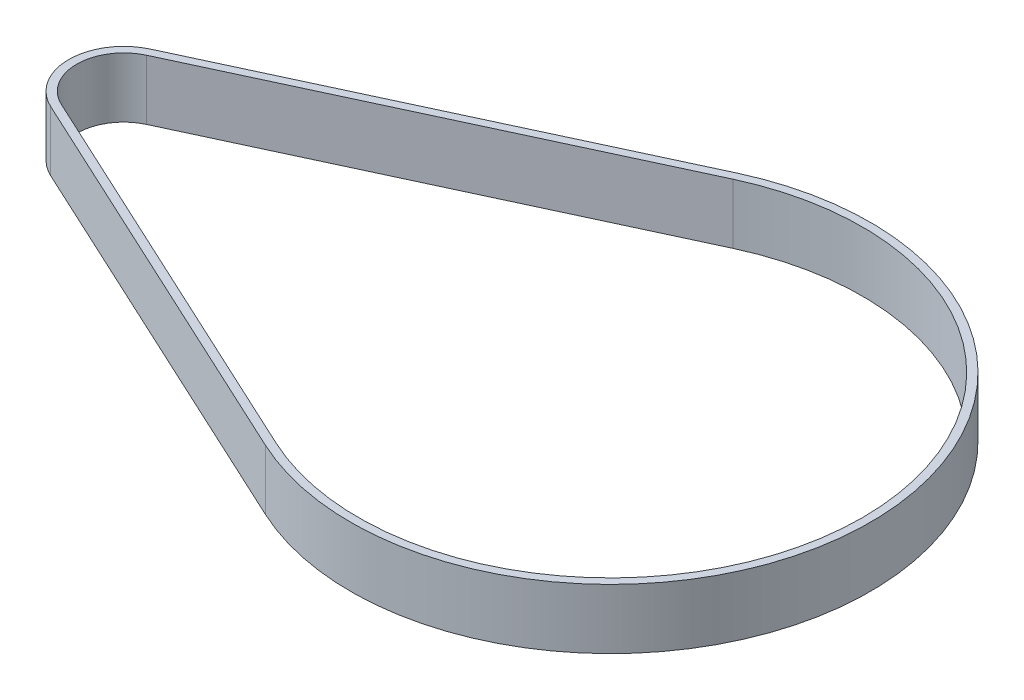
ISO-10303-21;
HEADER;
FILE_DESCRIPTION(('STEP AP214'),'2;1');
FILE_NAME('part.step','',(''),(''),'','','');
FILE_SCHEMA(('AUTOMOTIVE_DESIGN { 1 0 10303 214 1 1 1 1 }'));
ENDSEC;
DATA;
#1=APPLICATION_CONTEXT('core data for automotive mechanical design processes');
#2=APPLICATION_PROTOCOL_DEFINITION('international standard','automotive_design',2000,#1);
#3=PRODUCT_CONTEXT('',#1,'mechanical');
#4=PRODUCT('Part','Part','',(#3));
#5=PRODUCT_RELATED_PRODUCT_CATEGORY('part','',(#4));
#6=PRODUCT_DEFINITION_FORMATION('','',#4);
#7=PRODUCT_DEFINITION_CONTEXT('part definition',#1,'design');
#8=PRODUCT_DEFINITION('design','',#6,#7);
#9=PRODUCT_DEFINITION_SHAPE('','',#8);
#10=(LENGTH_UNIT() NAMED_UNIT(*) SI_UNIT(.MILLI.,.METRE.));
#11=(NAMED_UNIT(*) PLANE_ANGLE_UNIT() SI_UNIT($,.RADIAN.));
#12=(NAMED_UNIT(*) SI_UNIT($,.STERADIAN.) SOLID_ANGLE_UNIT());
#13=UNCERTAINTY_MEASURE_WITH_UNIT(LENGTH_MEASURE(1.E-05),#10,'distance_accuracy_value','');
#14=(GEOMETRIC_REPRESENTATION_CONTEXT(3) GLOBAL_UNCERTAINTY_ASSIGNED_CONTEXT((#13)) GLOBAL_UNIT_ASSIGNED_CONTEXT((#10,
#11,#12)) REPRESENTATION_CONTEXT('',''));
#15=CARTESIAN_POINT('',(0.,0.,0.));
#16=DIRECTION('',(0.,0.,1.));
#17=DIRECTION('',(1.,0.,0.));
#18=AXIS2_PLACEMENT_3D('',#15,#16,#17);
#19=CARTESIAN_POINT('',(-48.725,6.,0.));
#20=DIRECTION('',(0.,1.,0.));
#21=DIRECTION('',(0.,0.,1.));
#22=AXIS2_PLACEMENT_3D('',#19,#20,#21);
#23=PLANE('',#22);
#24=CARTESIAN_POINT('',(-48.725,6.,0.));
#25=DIRECTION('',(0.,1.,0.));
#26=DIRECTION('',(0.,0.,1.));
#27=AXIS2_PLACEMENT_3D('',#24,#25,#26);
#28=CIRCLE('',#27,5.5);
#29=CARTESIAN_POINT('',(-51.0401359671626,6.,-4.98900245074603));
#30=VERTEX_POINT('',#29);
#31=CARTESIAN_POINT('',(-51.0401359671626,6.,4.98900245074603));
#32=VERTEX_POINT('',#31);
#33=EDGE_CURVE('E134',#30,#32,#28,.T.);
#34=ORIENTED_EDGE('',*,*,#33,.T.);
#35=DIRECTION('',(0.907091354681096,0.,0.42093381221139));
#36=VECTOR('',#35,1.);
#37=CARTESIAN_POINT('',(-51.0401359671626,6.,4.98900245074603));
#38=LINE('',#37,#36);
#39=CARTESIAN_POINT('',(-10.9484884556183,6.,23.5934461352553));
#40=VERTEX_POINT('',#39);
#41=EDGE_CURVE('E137',#32,#40,#38,.T.);
#42=ORIENTED_EDGE('',*,*,#41,.T.);
#43=CARTESIAN_POINT('',(0.,6.,0.));
#44=DIRECTION('',(0.,1.,0.));
#45=DIRECTION('',(0.,0.,1.));
#46=AXIS2_PLACEMENT_3D('',#43,#44,#45);
#47=CIRCLE('',#46,26.01);
#48=CARTESIAN_POINT('',(-10.9484884556183,6.,-23.5934461352553));
#49=VERTEX_POINT('',#48);
#50=EDGE_CURVE('E140',#40,#49,#47,.T.);
#51=ORIENTED_EDGE('',*,*,#50,.T.);
#52=DIRECTION('',(-0.907091354681096,0.,0.42093381221139));
#53=VECTOR('',#52,1.);
#54=CARTESIAN_POINT('',(-51.0401359671626,6.,-4.98900245074603));
#55=LINE('',#54,#53);
#56=EDGE_CURVE('E142',#49,#30,#55,.T.);
#57=ORIENTED_EDGE('',*,*,#56,.T.);
#58=EDGE_LOOP('',(#34,#42,#51,#57));
#59=FACE_BOUND('',#58,.T.);
#60=DIRECTION('',(0.907091354681096,0.,0.42093381221139));
#61=VECTOR('',#60,1.);
#62=CARTESIAN_POINT('',(-50.7033889173935,6.,4.26332936700115));
#63=LINE('',#62,#61);
#64=CARTESIAN_POINT('',(-50.7033889173935,6.,4.26332936700115));
#65=VERTEX_POINT('',#64);
#66=CARTESIAN_POINT('',(-10.6117414058492,6.,22.8677730515104));
#67=VERTEX_POINT('',#66);
#68=EDGE_CURVE('E106',#65,#67,#63,.T.);
#69=ORIENTED_EDGE('',*,*,#68,.F.);
#70=CARTESIAN_POINT('',(-48.725,6.,0.));
#71=DIRECTION('',(0.,1.,0.));
#72=DIRECTION('',(0.,0.,1.));
#73=AXIS2_PLACEMENT_3D('',#70,#71,#72);
#74=CIRCLE('',#73,4.69999999999999);
#75=CARTESIAN_POINT('',(-50.7033889173935,6.,-4.26332936700115));
#76=VERTEX_POINT('',#75);
#77=EDGE_CURVE('E98',#76,#65,#74,.T.);
#78=ORIENTED_EDGE('',*,*,#77,.F.);
#79=DIRECTION('',(-0.907091354681096,0.,0.42093381221139));
#80=VECTOR('',#79,1.);
#81=CARTESIAN_POINT('',(-50.7033889173935,6.,-4.26332936700115));
#82=LINE('',#81,#80);
#83=CARTESIAN_POINT('',(-10.6117414058492,6.,-22.8677730515104));
#84=VERTEX_POINT('',#83);
#85=EDGE_CURVE('E120',#84,#76,#82,.T.);
#86=ORIENTED_EDGE('',*,*,#85,.F.);
#87=CARTESIAN_POINT('',(0.,6.,0.));
#88=DIRECTION('',(0.,1.,0.));
#89=DIRECTION('',(0.,0.,1.));
#90=AXIS2_PLACEMENT_3D('',#87,#88,#89);
#91=CIRCLE('',#90,25.21);
#92=EDGE_CURVE('E118',#67,#84,#91,.T.);
#93=ORIENTED_EDGE('',*,*,#92,.F.);
#94=EDGE_LOOP('',(#69,#78,#86,#93));
#95=FACE_BOUND('',#94,.T.);
#96=ADVANCED_FACE('F33',(#59,#95),#23,.T.);
#97=CARTESIAN_POINT('',(-48.725,0.,0.));
#98=DIRECTION('',(0.,1.,0.));
#99=DIRECTION('',(0.,0.,1.));
#100=AXIS2_PLACEMENT_3D('',#97,#98,#99);
#101=PLANE('',#100);
#102=CARTESIAN_POINT('',(-48.725,0.,0.));
#103=DIRECTION('',(0.,1.,0.));
#104=DIRECTION('',(0.,0.,1.));
#105=AXIS2_PLACEMENT_3D('',#102,#103,#104);
#106=CIRCLE('',#105,5.5);
#107=CARTESIAN_POINT('',(-51.0401359671626,0.,-4.98900245074603));
#108=VERTEX_POINT('',#107);
#109=CARTESIAN_POINT('',(-51.0401359671626,0.,4.98900245074603));
#110=VERTEX_POINT('',#109);
#111=EDGE_CURVE('E114',#108,#110,#106,.T.);
#112=ORIENTED_EDGE('',*,*,#111,.F.);
#113=DIRECTION('',(-0.907091354681096,0.,0.42093381221139));
#114=VECTOR('',#113,1.);
#115=CARTESIAN_POINT('',(-51.0401359671626,0.,-4.98900245074603));
#116=LINE('',#115,#114);
#117=CARTESIAN_POINT('',(-10.9484884556183,0.,-23.5934461352553));
#118=VERTEX_POINT('',#117);
#119=EDGE_CURVE('E138',#118,#108,#116,.T.);
#120=ORIENTED_EDGE('',*,*,#119,.F.);
#121=CARTESIAN_POINT('',(0.,0.,0.));
#122=DIRECTION('',(0.,1.,0.));
#123=DIRECTION('',(0.,0.,1.));
#124=AXIS2_PLACEMENT_3D('',#121,#122,#123);
#125=CIRCLE('',#124,26.01);
#126=CARTESIAN_POINT('',(-10.9484884556183,0.,23.5934461352553));
#127=VERTEX_POINT('',#126);
#128=EDGE_CURVE('E149',#127,#118,#125,.T.);
#129=ORIENTED_EDGE('',*,*,#128,.F.);
#130=DIRECTION('',(0.907091354681096,0.,0.42093381221139));
#131=VECTOR('',#130,1.);
#132=CARTESIAN_POINT('',(-51.0401359671626,0.,4.98900245074603));
#133=LINE('',#132,#131);
#134=EDGE_CURVE('E147',#110,#127,#133,.T.);
#135=ORIENTED_EDGE('',*,*,#134,.F.);
#136=EDGE_LOOP('',(#112,#120,#129,#135));
#137=FACE_BOUND('',#136,.T.);
#138=CARTESIAN_POINT('',(-48.725,0.,0.));
#139=DIRECTION('',(0.,1.,0.));
#140=DIRECTION('',(0.,0.,1.));
#141=AXIS2_PLACEMENT_3D('',#138,#139,#140);
#142=CIRCLE('',#141,4.69999999999999);
#143=CARTESIAN_POINT('',(-50.7033889173935,0.,-4.26332936700115));
#144=VERTEX_POINT('',#143);
#145=CARTESIAN_POINT('',(-50.7033889173935,0.,4.26332936700115));
#146=VERTEX_POINT('',#145);
#147=EDGE_CURVE('E56',#144,#146,#142,.T.);
#148=ORIENTED_EDGE('',*,*,#147,.T.);
#149=DIRECTION('',(0.907091354681096,0.,0.42093381221139));
#150=VECTOR('',#149,1.);
#151=CARTESIAN_POINT('',(-50.7033889173935,0.,4.26332936700115));
#152=LINE('',#151,#150);
#153=CARTESIAN_POINT('',(-10.6117414058492,0.,22.8677730515104));
#154=VERTEX_POINT('',#153);
#155=EDGE_CURVE('E113',#146,#154,#152,.T.);
#156=ORIENTED_EDGE('',*,*,#155,.T.);
#157=CARTESIAN_POINT('',(0.,0.,0.));
#158=DIRECTION('',(0.,1.,0.));
#159=DIRECTION('',(0.,0.,1.));
#160=AXIS2_PLACEMENT_3D('',#157,#158,#159);
#161=CIRCLE('',#160,25.21);
#162=CARTESIAN_POINT('',(-10.6117414058492,0.,-22.8677730515104));
#163=VERTEX_POINT('',#162);
#164=EDGE_CURVE('E126',#154,#163,#161,.T.);
#165=ORIENTED_EDGE('',*,*,#164,.T.);
#166=DIRECTION('',(-0.907091354681096,0.,0.42093381221139));
#167=VECTOR('',#166,1.);
#168=CARTESIAN_POINT('',(-50.7033889173935,0.,-4.26332936700115));
#169=LINE('',#168,#167);
#170=EDGE_CURVE('E107',#163,#144,#169,.T.);
#171=ORIENTED_EDGE('',*,*,#170,.T.);
#172=EDGE_LOOP('',(#148,#156,#165,#171));
#173=FACE_BOUND('',#172,.T.);
#174=ADVANCED_FACE('F167',(#137,#173),#101,.F.);
#175=CARTESIAN_POINT('',(-48.725,6.,0.));
#176=DIRECTION('',(0.,-1.,0.));
#177=DIRECTION('',(0.,0.,-1.));
#178=AXIS2_PLACEMENT_3D('',#175,#176,#177);
#179=CYLINDRICAL_SURFACE('',#178,5.5);
#180=ORIENTED_EDGE('',*,*,#111,.T.);
#181=DIRECTION('',(0.,-1.,0.));
#182=VECTOR('',#181,1.);
#183=CARTESIAN_POINT('',(-51.0401359671626,6.,4.98900245074603));
#184=LINE('',#183,#182);
#185=EDGE_CURVE('E11',#32,#110,#184,.T.);
#186=ORIENTED_EDGE('',*,*,#185,.F.);
#187=ORIENTED_EDGE('',*,*,#33,.F.);
#188=DIRECTION('',(0.,-1.,0.));
#189=VECTOR('',#188,1.);
#190=CARTESIAN_POINT('',(-51.0401359671626,6.,-4.98900245074603));
#191=LINE('',#190,#189);
#192=EDGE_CURVE('E144',#30,#108,#191,.T.);
#193=ORIENTED_EDGE('',*,*,#192,.T.);
#194=EDGE_LOOP('',(#180,#186,#187,#193));
#195=FACE_BOUND('',#194,.T.);
#196=ADVANCED_FACE('F35',(#195),#179,.T.);
#197=CARTESIAN_POINT('',(-51.0401359671626,6.,4.98900245074603));
#198=DIRECTION('',(0.42093381221139,0.,-0.907091354681096));
#199=DIRECTION('',(-0.907091354681096,0.,-0.42093381221139));
#200=AXIS2_PLACEMENT_3D('',#197,#198,#199);
#201=PLANE('',#200);
#202=ORIENTED_EDGE('',*,*,#134,.T.);
#203=DIRECTION('',(0.,-1.,0.));
#204=VECTOR('',#203,1.);
#205=CARTESIAN_POINT('',(-10.9484884556183,6.,23.5934461352553));
#206=LINE('',#205,#204);
#207=EDGE_CURVE('E41',#40,#127,#206,.T.);
#208=ORIENTED_EDGE('',*,*,#207,.F.);
#209=ORIENTED_EDGE('',*,*,#41,.F.);
#210=ORIENTED_EDGE('',*,*,#185,.T.);
#211=EDGE_LOOP('',(#202,#208,#209,#210));
#212=FACE_BOUND('',#211,.T.);
#213=ADVANCED_FACE('F177',(#212),#201,.F.);
#214=CARTESIAN_POINT('',(0.,6.,0.));
#215=DIRECTION('',(0.,-1.,0.));
#216=DIRECTION('',(0.,0.,-1.));
#217=AXIS2_PLACEMENT_3D('',#214,#215,#216);
#218=CYLINDRICAL_SURFACE('',#217,26.01);
#219=ORIENTED_EDGE('',*,*,#128,.T.);
#220=DIRECTION('',(0.,-1.,0.));
#221=VECTOR('',#220,1.);
#222=CARTESIAN_POINT('',(-10.9484884556183,6.,-23.5934461352553));
#223=LINE('',#222,#221);
#224=EDGE_CURVE('E154',#49,#118,#223,.T.);
#225=ORIENTED_EDGE('',*,*,#224,.F.);
#226=ORIENTED_EDGE('',*,*,#50,.F.);
#227=ORIENTED_EDGE('',*,*,#207,.T.);
#228=EDGE_LOOP('',(#219,#225,#226,#227));
#229=FACE_BOUND('',#228,.T.);
#230=ADVANCED_FACE('F161',(#229),#218,.T.);
#231=CARTESIAN_POINT('',(-51.0401359671626,6.,-4.98900245074603));
#232=DIRECTION('',(0.42093381221139,0.,0.907091354681096));
#233=DIRECTION('',(0.907091354681096,0.,-0.42093381221139));
#234=AXIS2_PLACEMENT_3D('',#231,#232,#233);
#235=PLANE('',#234);
#236=ORIENTED_EDGE('',*,*,#119,.T.);
#237=ORIENTED_EDGE('',*,*,#192,.F.);
#238=ORIENTED_EDGE('',*,*,#56,.F.);
#239=ORIENTED_EDGE('',*,*,#224,.T.);
#240=EDGE_LOOP('',(#236,#237,#238,#239));
#241=FACE_BOUND('',#240,.T.);
#242=ADVANCED_FACE('F171',(#241),#235,.F.);
#243=CARTESIAN_POINT('',(-48.725,6.,0.));
#244=DIRECTION('',(0.,-1.,0.));
#245=DIRECTION('',(0.,0.,-1.));
#246=AXIS2_PLACEMENT_3D('',#243,#244,#245);
#247=CYLINDRICAL_SURFACE('',#246,4.69999999999999);
#248=ORIENTED_EDGE('',*,*,#147,.F.);
#249=DIRECTION('',(0.,-1.,0.));
#250=VECTOR('',#249,1.);
#251=CARTESIAN_POINT('',(-50.7033889173935,6.,-4.26332936700115));
#252=LINE('',#251,#250);
#253=EDGE_CURVE('E102',#76,#144,#252,.T.);
#254=ORIENTED_EDGE('',*,*,#253,.F.);
#255=ORIENTED_EDGE('',*,*,#77,.T.);
#256=DIRECTION('',(0.,-1.,0.));
#257=VECTOR('',#256,1.);
#258=CARTESIAN_POINT('',(-50.7033889173935,6.,4.26332936700115));
#259=LINE('',#258,#257);
#260=EDGE_CURVE('E101',#65,#146,#259,.T.);
#261=ORIENTED_EDGE('',*,*,#260,.T.);
#262=EDGE_LOOP('',(#248,#254,#255,#261));
#263=FACE_BOUND('',#262,.T.);
#264=ADVANCED_FACE('F100',(#263),#247,.F.);
#265=CARTESIAN_POINT('',(-50.7033889173935,6.,4.26332936700115));
#266=DIRECTION('',(0.42093381221139,0.,-0.907091354681096));
#267=DIRECTION('',(-0.907091354681096,0.,-0.42093381221139));
#268=AXIS2_PLACEMENT_3D('',#265,#266,#267);
#269=PLANE('',#268);
#270=ORIENTED_EDGE('',*,*,#155,.F.);
#271=ORIENTED_EDGE('',*,*,#260,.F.);
#272=ORIENTED_EDGE('',*,*,#68,.T.);
#273=DIRECTION('',(0.,-1.,0.));
#274=VECTOR('',#273,1.);
#275=CARTESIAN_POINT('',(-10.6117414058492,6.,22.8677730515104));
#276=LINE('',#275,#274);
#277=EDGE_CURVE('E115',#67,#154,#276,.T.);
#278=ORIENTED_EDGE('',*,*,#277,.T.);
#279=EDGE_LOOP('',(#270,#271,#272,#278));
#280=FACE_BOUND('',#279,.T.);
#281=ADVANCED_FACE('F110',(#280),#269,.T.);
#282=CARTESIAN_POINT('',(0.,6.,0.));
#283=DIRECTION('',(0.,-1.,0.));
#284=DIRECTION('',(0.,0.,-1.));
#285=AXIS2_PLACEMENT_3D('',#282,#283,#284);
#286=CYLINDRICAL_SURFACE('',#285,25.21);
#287=ORIENTED_EDGE('',*,*,#164,.F.);
#288=ORIENTED_EDGE('',*,*,#277,.F.);
#289=ORIENTED_EDGE('',*,*,#92,.T.);
#290=DIRECTION('',(0.,-1.,0.));
#291=VECTOR('',#290,1.);
#292=CARTESIAN_POINT('',(-10.6117414058492,6.,-22.8677730515104));
#293=LINE('',#292,#291);
#294=EDGE_CURVE('E48',#84,#163,#293,.T.);
#295=ORIENTED_EDGE('',*,*,#294,.T.);
#296=EDGE_LOOP('',(#287,#288,#289,#295));
#297=FACE_BOUND('',#296,.T.);
#298=ADVANCED_FACE('F200',(#297),#286,.F.);
#299=CARTESIAN_POINT('',(-50.7033889173935,6.,-4.26332936700115));
#300=DIRECTION('',(0.42093381221139,0.,0.907091354681096));
#301=DIRECTION('',(0.907091354681096,0.,-0.42093381221139));
#302=AXIS2_PLACEMENT_3D('',#299,#300,#301);
#303=PLANE('',#302);
#304=ORIENTED_EDGE('',*,*,#170,.F.);
#305=ORIENTED_EDGE('',*,*,#294,.F.);
#306=ORIENTED_EDGE('',*,*,#85,.T.);
#307=ORIENTED_EDGE('',*,*,#253,.T.);
#308=EDGE_LOOP('',(#304,#305,#306,#307));
#309=FACE_BOUND('',#308,.T.);
#310=ADVANCED_FACE('F204',(#309),#303,.T.);
#311=CLOSED_SHELL('',(#96,#174,#196,#213,#230,#242,#264,#281,#298,#310));
#312=MANIFOLD_SOLID_BREP('B2',#311);
#313=ADVANCED_BREP_SHAPE_REPRESENTATION('',(#18,#312),#14);
#314=SHAPE_DEFINITION_REPRESENTATION(#9,#313);
ENDSEC;
END-ISO-10303-21;
